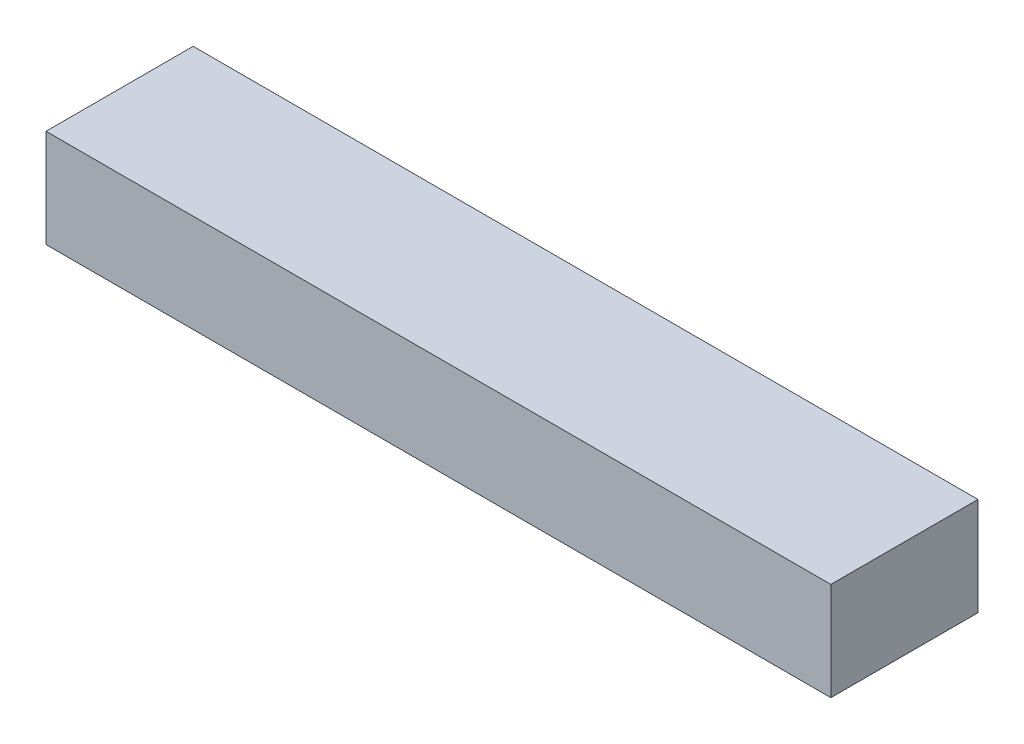
ISO-10303-21;
HEADER;
FILE_DESCRIPTION(('STEP AP214'),'2;1');
FILE_NAME('part.step','',(''),(''),'','','');
FILE_SCHEMA(('AUTOMOTIVE_DESIGN { 1 0 10303 214 1 1 1 1 }'));
ENDSEC;
DATA;
#1=APPLICATION_CONTEXT('core data for automotive mechanical design processes');
#2=APPLICATION_PROTOCOL_DEFINITION('international standard','automotive_design',2000,#1);
#3=PRODUCT_CONTEXT('',#1,'mechanical');
#4=PRODUCT('Part','Part','',(#3));
#5=PRODUCT_RELATED_PRODUCT_CATEGORY('part','',(#4));
#6=PRODUCT_DEFINITION_FORMATION('','',#4);
#7=PRODUCT_DEFINITION_CONTEXT('part definition',#1,'design');
#8=PRODUCT_DEFINITION('design','',#6,#7);
#9=PRODUCT_DEFINITION_SHAPE('','',#8);
#10=(LENGTH_UNIT() NAMED_UNIT(*) SI_UNIT(.MILLI.,.METRE.));
#11=(NAMED_UNIT(*) PLANE_ANGLE_UNIT() SI_UNIT($,.RADIAN.));
#12=(NAMED_UNIT(*) SI_UNIT($,.STERADIAN.) SOLID_ANGLE_UNIT());
#13=UNCERTAINTY_MEASURE_WITH_UNIT(LENGTH_MEASURE(1.E-05),#10,'distance_accuracy_value','');
#14=(GEOMETRIC_REPRESENTATION_CONTEXT(3) GLOBAL_UNCERTAINTY_ASSIGNED_CONTEXT((#13)) GLOBAL_UNIT_ASSIGNED_CONTEXT((#10,
#11,#12)) REPRESENTATION_CONTEXT('',''));
#15=CARTESIAN_POINT('',(0.,0.,0.));
#16=DIRECTION('',(0.,0.,1.));
#17=DIRECTION('',(1.,0.,0.));
#18=AXIS2_PLACEMENT_3D('',#15,#16,#17);
#19=CARTESIAN_POINT('',(203.2,50.8,38.1));
#20=DIRECTION('',(-1.,0.,0.));
#21=DIRECTION('',(0.,0.,1.));
#22=AXIS2_PLACEMENT_3D('',#19,#20,#21);
#23=PLANE('',#22);
#24=DIRECTION('',(0.,0.,-1.));
#25=VECTOR('',#24,1.);
#26=CARTESIAN_POINT('',(203.2,0.,38.1));
#27=LINE('',#26,#25);
#28=CARTESIAN_POINT('',(203.2,0.,38.1));
#29=VERTEX_POINT('',#28);
#30=CARTESIAN_POINT('',(203.2,0.,-38.1));
#31=VERTEX_POINT('',#30);
#32=EDGE_CURVE('E107',#29,#31,#27,.T.);
#33=ORIENTED_EDGE('',*,*,#32,.T.);
#34=DIRECTION('',(0.,-1.,0.));
#35=VECTOR('',#34,1.);
#36=CARTESIAN_POINT('',(203.2,50.8,-38.1));
#37=LINE('',#36,#35);
#38=CARTESIAN_POINT('',(203.2,50.8,-38.1));
#39=VERTEX_POINT('',#38);
#40=EDGE_CURVE('E11',#39,#31,#37,.T.);
#41=ORIENTED_EDGE('',*,*,#40,.F.);
#42=DIRECTION('',(0.,0.,-1.));
#43=VECTOR('',#42,1.);
#44=CARTESIAN_POINT('',(203.2,50.8,38.1));
#45=LINE('',#44,#43);
#46=CARTESIAN_POINT('',(203.2,50.8,38.1));
#47=VERTEX_POINT('',#46);
#48=EDGE_CURVE('E91',#47,#39,#45,.T.);
#49=ORIENTED_EDGE('',*,*,#48,.F.);
#50=DIRECTION('',(0.,-1.,0.));
#51=VECTOR('',#50,1.);
#52=CARTESIAN_POINT('',(203.2,50.8,38.1));
#53=LINE('',#52,#51);
#54=EDGE_CURVE('E103',#47,#29,#53,.T.);
#55=ORIENTED_EDGE('',*,*,#54,.T.);
#56=EDGE_LOOP('',(#33,#41,#49,#55));
#57=FACE_BOUND('',#56,.T.);
#58=ADVANCED_FACE('F39',(#57),#23,.F.);
#59=CARTESIAN_POINT('',(-203.2,50.8,-38.1));
#60=DIRECTION('',(0.,0.,1.));
#61=DIRECTION('',(1.,0.,0.));
#62=AXIS2_PLACEMENT_3D('',#59,#60,#61);
#63=PLANE('',#62);
#64=DIRECTION('',(-1.,0.,0.));
#65=VECTOR('',#64,1.);
#66=CARTESIAN_POINT('',(-203.2,0.,-38.1));
#67=LINE('',#66,#65);
#68=CARTESIAN_POINT('',(-203.2,0.,-38.1));
#69=VERTEX_POINT('',#68);
#70=EDGE_CURVE('E96',#31,#69,#67,.T.);
#71=ORIENTED_EDGE('',*,*,#70,.T.);
#72=DIRECTION('',(0.,-1.,0.));
#73=VECTOR('',#72,1.);
#74=CARTESIAN_POINT('',(-203.2,50.8,-38.1));
#75=LINE('',#74,#73);
#76=CARTESIAN_POINT('',(-203.2,50.8,-38.1));
#77=VERTEX_POINT('',#76);
#78=EDGE_CURVE('E48',#77,#69,#75,.T.);
#79=ORIENTED_EDGE('',*,*,#78,.F.);
#80=DIRECTION('',(-1.,0.,0.));
#81=VECTOR('',#80,1.);
#82=CARTESIAN_POINT('',(-203.2,50.8,-38.1));
#83=LINE('',#82,#81);
#84=EDGE_CURVE('E86',#39,#77,#83,.T.);
#85=ORIENTED_EDGE('',*,*,#84,.F.);
#86=ORIENTED_EDGE('',*,*,#40,.T.);
#87=EDGE_LOOP('',(#71,#79,#85,#86));
#88=FACE_BOUND('',#87,.T.);
#89=ADVANCED_FACE('F95',(#88),#63,.F.);
#90=CARTESIAN_POINT('',(-203.2,50.8,38.1));
#91=DIRECTION('',(1.,0.,0.));
#92=DIRECTION('',(0.,0.,-1.));
#93=AXIS2_PLACEMENT_3D('',#90,#91,#92);
#94=PLANE('',#93);
#95=DIRECTION('',(0.,0.,1.));
#96=VECTOR('',#95,1.);
#97=CARTESIAN_POINT('',(-203.2,0.,38.1));
#98=LINE('',#97,#96);
#99=CARTESIAN_POINT('',(-203.2,0.,38.1));
#100=VERTEX_POINT('',#99);
#101=EDGE_CURVE('E73',#69,#100,#98,.T.);
#102=ORIENTED_EDGE('',*,*,#101,.T.);
#103=DIRECTION('',(0.,-1.,0.));
#104=VECTOR('',#103,1.);
#105=CARTESIAN_POINT('',(-203.2,50.8,38.1));
#106=LINE('',#105,#104);
#107=CARTESIAN_POINT('',(-203.2,50.8,38.1));
#108=VERTEX_POINT('',#107);
#109=EDGE_CURVE('E98',#108,#100,#106,.T.);
#110=ORIENTED_EDGE('',*,*,#109,.F.);
#111=DIRECTION('',(0.,0.,1.));
#112=VECTOR('',#111,1.);
#113=CARTESIAN_POINT('',(-203.2,50.8,38.1));
#114=LINE('',#113,#112);
#115=EDGE_CURVE('E89',#77,#108,#114,.T.);
#116=ORIENTED_EDGE('',*,*,#115,.F.);
#117=ORIENTED_EDGE('',*,*,#78,.T.);
#118=EDGE_LOOP('',(#102,#110,#116,#117));
#119=FACE_BOUND('',#118,.T.);
#120=ADVANCED_FACE('F99',(#119),#94,.F.);
#121=CARTESIAN_POINT('',(-203.2,50.8,38.1));
#122=DIRECTION('',(0.,0.,-1.));
#123=DIRECTION('',(-1.,0.,0.));
#124=AXIS2_PLACEMENT_3D('',#121,#122,#123);
#125=PLANE('',#124);
#126=DIRECTION('',(1.,0.,0.));
#127=VECTOR('',#126,1.);
#128=CARTESIAN_POINT('',(-203.2,0.,38.1));
#129=LINE('',#128,#127);
#130=EDGE_CURVE('E79',#100,#29,#129,.T.);
#131=ORIENTED_EDGE('',*,*,#130,.T.);
#132=ORIENTED_EDGE('',*,*,#54,.F.);
#133=DIRECTION('',(1.,0.,0.));
#134=VECTOR('',#133,1.);
#135=CARTESIAN_POINT('',(-203.2,50.8,38.1));
#136=LINE('',#135,#134);
#137=EDGE_CURVE('E56',#108,#47,#136,.T.);
#138=ORIENTED_EDGE('',*,*,#137,.F.);
#139=ORIENTED_EDGE('',*,*,#109,.T.);
#140=EDGE_LOOP('',(#131,#132,#138,#139));
#141=FACE_BOUND('',#140,.T.);
#142=ADVANCED_FACE('F120',(#141),#125,.F.);
#143=CARTESIAN_POINT('',(0.,50.8,0.));
#144=DIRECTION('',(0.,-1.,0.));
#145=DIRECTION('',(0.,0.,-1.));
#146=AXIS2_PLACEMENT_3D('',#143,#144,#145);
#147=PLANE('',#146);
#148=ORIENTED_EDGE('',*,*,#48,.T.);
#149=ORIENTED_EDGE('',*,*,#84,.T.);
#150=ORIENTED_EDGE('',*,*,#115,.T.);
#151=ORIENTED_EDGE('',*,*,#137,.T.);
#152=EDGE_LOOP('',(#148,#149,#150,#151));
#153=FACE_BOUND('',#152,.T.);
#154=ADVANCED_FACE('F87',(#153),#147,.F.);
#155=CARTESIAN_POINT('',(0.,0.,0.));
#156=DIRECTION('',(0.,-1.,0.));
#157=DIRECTION('',(0.,0.,-1.));
#158=AXIS2_PLACEMENT_3D('',#155,#156,#157);
#159=PLANE('',#158);
#160=ORIENTED_EDGE('',*,*,#32,.F.);
#161=ORIENTED_EDGE('',*,*,#130,.F.);
#162=ORIENTED_EDGE('',*,*,#101,.F.);
#163=ORIENTED_EDGE('',*,*,#70,.F.);
#164=EDGE_LOOP('',(#160,#161,#162,#163));
#165=FACE_BOUND('',#164,.T.);
#166=ADVANCED_FACE('F123',(#165),#159,.T.);
#167=CLOSED_SHELL('',(#58,#89,#120,#142,#154,#166));
#168=MANIFOLD_SOLID_BREP('B2',#167);
#169=ADVANCED_BREP_SHAPE_REPRESENTATION('',(#18,#168),#14);
#170=SHAPE_DEFINITION_REPRESENTATION(#9,#169);
ENDSEC;
END-ISO-10303-21;
